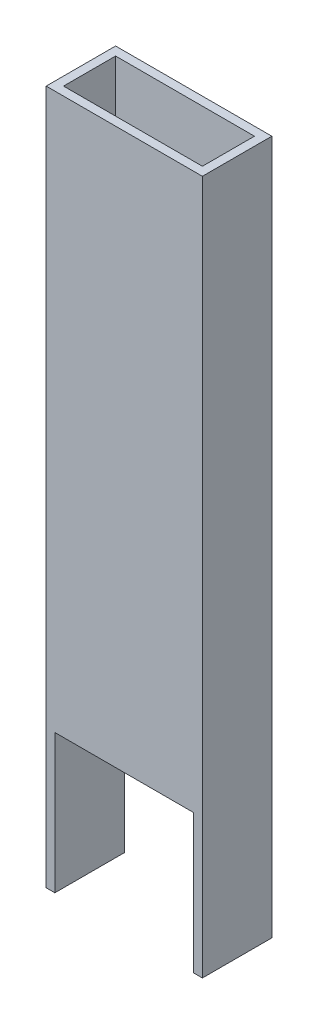
ISO-10303-21;
HEADER;
FILE_DESCRIPTION(('STEP AP214'),'2;1');
FILE_NAME('part.step','',(''),(''),'','','');
FILE_SCHEMA(('AUTOMOTIVE_DESIGN { 1 0 10303 214 1 1 1 1 }'));
ENDSEC;
DATA;
#1=APPLICATION_CONTEXT('core data for automotive mechanical design processes');
#2=APPLICATION_PROTOCOL_DEFINITION('international standard','automotive_design',2000,#1);
#3=PRODUCT_CONTEXT('',#1,'mechanical');
#4=PRODUCT('Part','Part','',(#3));
#5=PRODUCT_RELATED_PRODUCT_CATEGORY('part','',(#4));
#6=PRODUCT_DEFINITION_FORMATION('','',#4);
#7=PRODUCT_DEFINITION_CONTEXT('part definition',#1,'design');
#8=PRODUCT_DEFINITION('design','',#6,#7);
#9=PRODUCT_DEFINITION_SHAPE('','',#8);
#10=(LENGTH_UNIT() NAMED_UNIT(*) SI_UNIT(.MILLI.,.METRE.));
#11=(NAMED_UNIT(*) PLANE_ANGLE_UNIT() SI_UNIT($,.RADIAN.));
#12=(NAMED_UNIT(*) SI_UNIT($,.STERADIAN.) SOLID_ANGLE_UNIT());
#13=UNCERTAINTY_MEASURE_WITH_UNIT(LENGTH_MEASURE(1.E-05),#10,'distance_accuracy_value','');
#14=(GEOMETRIC_REPRESENTATION_CONTEXT(3) GLOBAL_UNCERTAINTY_ASSIGNED_CONTEXT((#13)) GLOBAL_UNIT_ASSIGNED_CONTEXT((#10,
#11,#12)) REPRESENTATION_CONTEXT('',''));
#15=CARTESIAN_POINT('',(0.,0.,0.));
#16=DIRECTION('',(0.,0.,1.));
#17=DIRECTION('',(1.,0.,0.));
#18=AXIS2_PLACEMENT_3D('',#15,#16,#17);
#19=CARTESIAN_POINT('',(-25.4,-76.2,12.7));
#20=DIRECTION('',(0.,1.,0.));
#21=DIRECTION('',(0.,0.,1.));
#22=AXIS2_PLACEMENT_3D('',#19,#20,#21);
#23=PLANE('',#22);
#24=DIRECTION('',(0.,0.,-1.));
#25=VECTOR('',#24,1.);
#26=CARTESIAN_POINT('',(-25.4,-76.2,12.7));
#27=LINE('',#26,#25);
#28=CARTESIAN_POINT('',(-25.4,-76.2,12.7));
#29=VERTEX_POINT('',#28);
#30=CARTESIAN_POINT('',(-25.4,-76.2,9.525));
#31=VERTEX_POINT('',#30);
#32=EDGE_CURVE('E201',#29,#31,#27,.T.);
#33=ORIENTED_EDGE('',*,*,#32,.T.);
#34=DIRECTION('',(1.,0.,0.));
#35=VECTOR('',#34,1.);
#36=CARTESIAN_POINT('',(-25.4,-76.2,9.525));
#37=LINE('',#36,#35);
#38=CARTESIAN_POINT('',(25.4,-76.2,9.525));
#39=VERTEX_POINT('',#38);
#40=EDGE_CURVE('E152',#31,#39,#37,.T.);
#41=ORIENTED_EDGE('',*,*,#40,.T.);
#42=DIRECTION('',(0.,0.,-1.));
#43=VECTOR('',#42,1.);
#44=CARTESIAN_POINT('',(25.4,-76.2,12.7));
#45=LINE('',#44,#43);
#46=CARTESIAN_POINT('',(25.4,-76.2,12.7));
#47=VERTEX_POINT('',#46);
#48=EDGE_CURVE('E198',#47,#39,#45,.T.);
#49=ORIENTED_EDGE('',*,*,#48,.F.);
#50=DIRECTION('',(1.,0.,0.));
#51=VECTOR('',#50,1.);
#52=CARTESIAN_POINT('',(-25.4,-76.2,12.7));
#53=LINE('',#52,#51);
#54=EDGE_CURVE('E168',#29,#47,#53,.T.);
#55=ORIENTED_EDGE('',*,*,#54,.F.);
#56=EDGE_LOOP('',(#33,#41,#49,#55));
#57=FACE_BOUND('',#56,.T.);
#58=ADVANCED_FACE('F33',(#57),#23,.F.);
#59=CARTESIAN_POINT('',(28.575,-127.,12.7));
#60=DIRECTION('',(-1.,0.,0.));
#61=DIRECTION('',(0.,0.,1.));
#62=AXIS2_PLACEMENT_3D('',#59,#60,#61);
#63=PLANE('',#62);
#64=DIRECTION('',(0.,1.,0.));
#65=VECTOR('',#64,1.);
#66=CARTESIAN_POINT('',(28.575,-127.,-12.7));
#67=LINE('',#66,#65);
#68=CARTESIAN_POINT('',(28.575,-127.,-12.7));
#69=VERTEX_POINT('',#68);
#70=CARTESIAN_POINT('',(28.575,127.,-12.7));
#71=VERTEX_POINT('',#70);
#72=EDGE_CURVE('E155',#69,#71,#67,.T.);
#73=ORIENTED_EDGE('',*,*,#72,.T.);
#74=DIRECTION('',(0.,0.,-1.));
#75=VECTOR('',#74,1.);
#76=CARTESIAN_POINT('',(28.575,127.,12.7));
#77=LINE('',#76,#75);
#78=CARTESIAN_POINT('',(28.575,127.,12.7));
#79=VERTEX_POINT('',#78);
#80=EDGE_CURVE('E11',#79,#71,#77,.T.);
#81=ORIENTED_EDGE('',*,*,#80,.F.);
#82=DIRECTION('',(0.,1.,0.));
#83=VECTOR('',#82,1.);
#84=CARTESIAN_POINT('',(28.575,-127.,12.7));
#85=LINE('',#84,#83);
#86=CARTESIAN_POINT('',(28.575,-127.,12.7));
#87=VERTEX_POINT('',#86);
#88=EDGE_CURVE('E156',#87,#79,#85,.T.);
#89=ORIENTED_EDGE('',*,*,#88,.F.);
#90=DIRECTION('',(0.,0.,-1.));
#91=VECTOR('',#90,1.);
#92=CARTESIAN_POINT('',(28.575,-127.,12.7));
#93=LINE('',#92,#91);
#94=EDGE_CURVE('E174',#87,#69,#93,.T.);
#95=ORIENTED_EDGE('',*,*,#94,.T.);
#96=EDGE_LOOP('',(#73,#81,#89,#95));
#97=FACE_BOUND('',#96,.T.);
#98=ADVANCED_FACE('F35',(#97),#63,.F.);
#99=CARTESIAN_POINT('',(-28.575,127.,12.7));
#100=DIRECTION('',(0.,-1.,0.));
#101=DIRECTION('',(0.,0.,-1.));
#102=AXIS2_PLACEMENT_3D('',#99,#100,#101);
#103=PLANE('',#102);
#104=DIRECTION('',(-1.,0.,0.));
#105=VECTOR('',#104,1.);
#106=CARTESIAN_POINT('',(25.4,127.,-9.525));
#107=LINE('',#106,#105);
#108=CARTESIAN_POINT('',(25.4,127.,-9.525));
#109=VERTEX_POINT('',#108);
#110=CARTESIAN_POINT('',(-25.4,127.,-9.525));
#111=VERTEX_POINT('',#110);
#112=EDGE_CURVE('E134',#109,#111,#107,.T.);
#113=ORIENTED_EDGE('',*,*,#112,.F.);
#114=DIRECTION('',(0.,0.,-1.));
#115=VECTOR('',#114,1.);
#116=CARTESIAN_POINT('',(25.4,127.,9.525));
#117=LINE('',#116,#115);
#118=CARTESIAN_POINT('',(25.4,127.,9.525));
#119=VERTEX_POINT('',#118);
#120=EDGE_CURVE('E48',#119,#109,#117,.T.);
#121=ORIENTED_EDGE('',*,*,#120,.F.);
#122=DIRECTION('',(1.,0.,0.));
#123=VECTOR('',#122,1.);
#124=CARTESIAN_POINT('',(-25.4,127.,9.525));
#125=LINE('',#124,#123);
#126=CARTESIAN_POINT('',(-25.4,127.,9.525));
#127=VERTEX_POINT('',#126);
#128=EDGE_CURVE('E141',#127,#119,#125,.T.);
#129=ORIENTED_EDGE('',*,*,#128,.F.);
#130=DIRECTION('',(0.,0.,1.));
#131=VECTOR('',#130,1.);
#132=CARTESIAN_POINT('',(-25.4,127.,-9.525));
#133=LINE('',#132,#131);
#134=EDGE_CURVE('E126',#111,#127,#133,.T.);
#135=ORIENTED_EDGE('',*,*,#134,.F.);
#136=EDGE_LOOP('',(#113,#121,#129,#135));
#137=FACE_BOUND('',#136,.T.);
#138=DIRECTION('',(-1.,0.,0.));
#139=VECTOR('',#138,1.);
#140=CARTESIAN_POINT('',(-28.575,127.,-12.7));
#141=LINE('',#140,#139);
#142=CARTESIAN_POINT('',(-28.575,127.,-12.7));
#143=VERTEX_POINT('',#142);
#144=EDGE_CURVE('E177',#71,#143,#141,.T.);
#145=ORIENTED_EDGE('',*,*,#144,.T.);
#146=DIRECTION('',(0.,0.,-1.));
#147=VECTOR('',#146,1.);
#148=CARTESIAN_POINT('',(-28.575,127.,12.7));
#149=LINE('',#148,#147);
#150=CARTESIAN_POINT('',(-28.575,127.,12.7));
#151=VERTEX_POINT('',#150);
#152=EDGE_CURVE('E41',#151,#143,#149,.T.);
#153=ORIENTED_EDGE('',*,*,#152,.F.);
#154=DIRECTION('',(-1.,0.,0.));
#155=VECTOR('',#154,1.);
#156=CARTESIAN_POINT('',(-28.575,127.,12.7));
#157=LINE('',#156,#155);
#158=EDGE_CURVE('E159',#79,#151,#157,.T.);
#159=ORIENTED_EDGE('',*,*,#158,.F.);
#160=ORIENTED_EDGE('',*,*,#80,.T.);
#161=EDGE_LOOP('',(#145,#153,#159,#160));
#162=FACE_BOUND('',#161,.T.);
#163=ADVANCED_FACE('F138',(#137,#162),#103,.F.);
#164=CARTESIAN_POINT('',(-28.575,-127.,12.7));
#165=DIRECTION('',(1.,0.,0.));
#166=DIRECTION('',(0.,0.,-1.));
#167=AXIS2_PLACEMENT_3D('',#164,#165,#166);
#168=PLANE('',#167);
#169=DIRECTION('',(0.,-1.,0.));
#170=VECTOR('',#169,1.);
#171=CARTESIAN_POINT('',(-28.575,-127.,-12.7));
#172=LINE('',#171,#170);
#173=CARTESIAN_POINT('',(-28.575,-127.,-12.7));
#174=VERTEX_POINT('',#173);
#175=EDGE_CURVE('E179',#143,#174,#172,.T.);
#176=ORIENTED_EDGE('',*,*,#175,.T.);
#177=DIRECTION('',(0.,0.,-1.));
#178=VECTOR('',#177,1.);
#179=CARTESIAN_POINT('',(-28.575,-127.,12.7));
#180=LINE('',#179,#178);
#181=CARTESIAN_POINT('',(-28.575,-127.,12.7));
#182=VERTEX_POINT('',#181);
#183=EDGE_CURVE('E206',#182,#174,#180,.T.);
#184=ORIENTED_EDGE('',*,*,#183,.F.);
#185=DIRECTION('',(0.,-1.,0.));
#186=VECTOR('',#185,1.);
#187=CARTESIAN_POINT('',(-28.575,-127.,12.7));
#188=LINE('',#187,#186);
#189=EDGE_CURVE('E162',#151,#182,#188,.T.);
#190=ORIENTED_EDGE('',*,*,#189,.F.);
#191=ORIENTED_EDGE('',*,*,#152,.T.);
#192=EDGE_LOOP('',(#176,#184,#190,#191));
#193=FACE_BOUND('',#192,.T.);
#194=ADVANCED_FACE('F213',(#193),#168,.F.);
#195=CARTESIAN_POINT('',(-28.575,-127.,12.7));
#196=DIRECTION('',(0.,1.,0.));
#197=DIRECTION('',(0.,0.,1.));
#198=AXIS2_PLACEMENT_3D('',#195,#196,#197);
#199=PLANE('',#198);
#200=DIRECTION('',(1.,0.,0.));
#201=VECTOR('',#200,1.);
#202=CARTESIAN_POINT('',(-28.575,-127.,-12.7));
#203=LINE('',#202,#201);
#204=CARTESIAN_POINT('',(-25.4,-127.,-12.7));
#205=VERTEX_POINT('',#204);
#206=EDGE_CURVE('E181',#174,#205,#203,.T.);
#207=ORIENTED_EDGE('',*,*,#206,.T.);
#208=DIRECTION('',(0.,0.,-1.));
#209=VECTOR('',#208,1.);
#210=CARTESIAN_POINT('',(-25.4,-127.,12.7));
#211=LINE('',#210,#209);
#212=CARTESIAN_POINT('',(-25.4,-127.,12.7));
#213=VERTEX_POINT('',#212);
#214=EDGE_CURVE('E204',#213,#205,#211,.T.);
#215=ORIENTED_EDGE('',*,*,#214,.F.);
#216=DIRECTION('',(1.,0.,0.));
#217=VECTOR('',#216,1.);
#218=CARTESIAN_POINT('',(-28.575,-127.,12.7));
#219=LINE('',#218,#217);
#220=EDGE_CURVE('E164',#182,#213,#219,.T.);
#221=ORIENTED_EDGE('',*,*,#220,.F.);
#222=ORIENTED_EDGE('',*,*,#183,.T.);
#223=EDGE_LOOP('',(#207,#215,#221,#222));
#224=FACE_BOUND('',#223,.T.);
#225=ADVANCED_FACE('F223',(#224),#199,.F.);
#226=CARTESIAN_POINT('',(-25.4,-127.,12.7));
#227=DIRECTION('',(-1.,0.,0.));
#228=DIRECTION('',(0.,0.,1.));
#229=AXIS2_PLACEMENT_3D('',#226,#227,#228);
#230=PLANE('',#229);
#231=CARTESIAN_POINT('',(-25.4,-76.2,-9.525));
#232=VERTEX_POINT('',#231);
#233=CARTESIAN_POINT('',(-25.4,-76.2,-12.7));
#234=VERTEX_POINT('',#233);
#235=EDGE_CURVE('E129',#232,#234,#27,.T.);
#236=ORIENTED_EDGE('',*,*,#235,.F.);
#237=DIRECTION('',(0.,1.,0.));
#238=VECTOR('',#237,1.);
#239=CARTESIAN_POINT('',(-25.4,-127.,-9.525));
#240=LINE('',#239,#238);
#241=EDGE_CURVE('E56',#232,#111,#240,.T.);
#242=ORIENTED_EDGE('',*,*,#241,.T.);
#243=ORIENTED_EDGE('',*,*,#134,.T.);
#244=DIRECTION('',(0.,1.,0.));
#245=VECTOR('',#244,1.);
#246=CARTESIAN_POINT('',(-25.4,-127.,9.525));
#247=LINE('',#246,#245);
#248=EDGE_CURVE('E130',#31,#127,#247,.T.);
#249=ORIENTED_EDGE('',*,*,#248,.F.);
#250=ORIENTED_EDGE('',*,*,#32,.F.);
#251=DIRECTION('',(0.,1.,0.));
#252=VECTOR('',#251,1.);
#253=CARTESIAN_POINT('',(-25.4,-127.,12.7));
#254=LINE('',#253,#252);
#255=EDGE_CURVE('E166',#213,#29,#254,.T.);
#256=ORIENTED_EDGE('',*,*,#255,.F.);
#257=ORIENTED_EDGE('',*,*,#214,.T.);
#258=DIRECTION('',(0.,1.,0.));
#259=VECTOR('',#258,1.);
#260=CARTESIAN_POINT('',(-25.4,-127.,-12.7));
#261=LINE('',#260,#259);
#262=EDGE_CURVE('E184',#205,#234,#261,.T.);
#263=ORIENTED_EDGE('',*,*,#262,.T.);
#264=EDGE_LOOP('',(#236,#242,#243,#249,#250,#256,#257,#263));
#265=FACE_BOUND('',#264,.T.);
#266=ADVANCED_FACE('F123',(#265),#230,.F.);
#267=CARTESIAN_POINT('',(25.4,-76.2,-9.525));
#268=VERTEX_POINT('',#267);
#269=CARTESIAN_POINT('',(25.4,-76.2,-12.7));
#270=VERTEX_POINT('',#269);
#271=EDGE_CURVE('E197',#268,#270,#45,.T.);
#272=ORIENTED_EDGE('',*,*,#271,.F.);
#273=DIRECTION('',(-1.,0.,0.));
#274=VECTOR('',#273,1.);
#275=CARTESIAN_POINT('',(-25.4,-76.2,-9.525));
#276=LINE('',#275,#274);
#277=EDGE_CURVE('E148',#268,#232,#276,.T.);
#278=ORIENTED_EDGE('',*,*,#277,.T.);
#279=ORIENTED_EDGE('',*,*,#235,.T.);
#280=DIRECTION('',(1.,0.,0.));
#281=VECTOR('',#280,1.);
#282=CARTESIAN_POINT('',(-25.4,-76.2,-12.7));
#283=LINE('',#282,#281);
#284=EDGE_CURVE('E186',#234,#270,#283,.T.);
#285=ORIENTED_EDGE('',*,*,#284,.T.);
#286=EDGE_LOOP('',(#272,#278,#279,#285));
#287=FACE_BOUND('',#286,.T.);
#288=ADVANCED_FACE('F243',(#287),#23,.F.);
#289=CARTESIAN_POINT('',(25.4,-76.2,12.7));
#290=DIRECTION('',(1.,0.,0.));
#291=DIRECTION('',(0.,1.,0.));
#292=AXIS2_PLACEMENT_3D('',#289,#290,#291);
#293=PLANE('',#292);
#294=DIRECTION('',(0.,-1.,0.));
#295=VECTOR('',#294,1.);
#296=CARTESIAN_POINT('',(25.4,-76.2,-12.7));
#297=LINE('',#296,#295);
#298=CARTESIAN_POINT('',(25.4,-127.,-12.7));
#299=VERTEX_POINT('',#298);
#300=EDGE_CURVE('E189',#270,#299,#297,.T.);
#301=ORIENTED_EDGE('',*,*,#300,.T.);
#302=DIRECTION('',(0.,0.,-1.));
#303=VECTOR('',#302,1.);
#304=CARTESIAN_POINT('',(25.4,-127.,12.7));
#305=LINE('',#304,#303);
#306=CARTESIAN_POINT('',(25.4,-127.,12.7));
#307=VERTEX_POINT('',#306);
#308=EDGE_CURVE('E195',#307,#299,#305,.T.);
#309=ORIENTED_EDGE('',*,*,#308,.F.);
#310=DIRECTION('',(0.,-1.,0.));
#311=VECTOR('',#310,1.);
#312=CARTESIAN_POINT('',(25.4,-76.2,12.7));
#313=LINE('',#312,#311);
#314=EDGE_CURVE('E170',#47,#307,#313,.T.);
#315=ORIENTED_EDGE('',*,*,#314,.F.);
#316=ORIENTED_EDGE('',*,*,#48,.T.);
#317=DIRECTION('',(0.,1.,0.));
#318=VECTOR('',#317,1.);
#319=CARTESIAN_POINT('',(25.4,-127.,9.525));
#320=LINE('',#319,#318);
#321=EDGE_CURVE('E146',#39,#119,#320,.T.);
#322=ORIENTED_EDGE('',*,*,#321,.T.);
#323=ORIENTED_EDGE('',*,*,#120,.T.);
#324=DIRECTION('',(0.,1.,0.));
#325=VECTOR('',#324,1.);
#326=CARTESIAN_POINT('',(25.4,-127.,-9.525));
#327=LINE('',#326,#325);
#328=EDGE_CURVE('E131',#268,#109,#327,.T.);
#329=ORIENTED_EDGE('',*,*,#328,.F.);
#330=ORIENTED_EDGE('',*,*,#271,.T.);
#331=EDGE_LOOP('',(#301,#309,#315,#316,#322,#323,#329,#330));
#332=FACE_BOUND('',#331,.T.);
#333=ADVANCED_FACE('F240',(#332),#293,.F.);
#334=CARTESIAN_POINT('',(25.4,-127.,12.7));
#335=DIRECTION('',(0.,1.,0.));
#336=DIRECTION('',(0.,0.,1.));
#337=AXIS2_PLACEMENT_3D('',#334,#335,#336);
#338=PLANE('',#337);
#339=DIRECTION('',(1.,0.,0.));
#340=VECTOR('',#339,1.);
#341=CARTESIAN_POINT('',(25.4,-127.,-12.7));
#342=LINE('',#341,#340);
#343=EDGE_CURVE('E160',#299,#69,#342,.T.);
#344=ORIENTED_EDGE('',*,*,#343,.T.);
#345=ORIENTED_EDGE('',*,*,#94,.F.);
#346=DIRECTION('',(1.,0.,0.));
#347=VECTOR('',#346,1.);
#348=CARTESIAN_POINT('',(25.4,-127.,12.7));
#349=LINE('',#348,#347);
#350=EDGE_CURVE('E172',#307,#87,#349,.T.);
#351=ORIENTED_EDGE('',*,*,#350,.F.);
#352=ORIENTED_EDGE('',*,*,#308,.T.);
#353=EDGE_LOOP('',(#344,#345,#351,#352));
#354=FACE_BOUND('',#353,.T.);
#355=ADVANCED_FACE('F236',(#354),#338,.F.);
#356=CARTESIAN_POINT('',(0.,0.,12.7));
#357=DIRECTION('',(0.,0.,-1.));
#358=DIRECTION('',(-1.,0.,0.));
#359=AXIS2_PLACEMENT_3D('',#356,#357,#358);
#360=PLANE('',#359);
#361=ORIENTED_EDGE('',*,*,#88,.T.);
#362=ORIENTED_EDGE('',*,*,#158,.T.);
#363=ORIENTED_EDGE('',*,*,#189,.T.);
#364=ORIENTED_EDGE('',*,*,#220,.T.);
#365=ORIENTED_EDGE('',*,*,#255,.T.);
#366=ORIENTED_EDGE('',*,*,#54,.T.);
#367=ORIENTED_EDGE('',*,*,#314,.T.);
#368=ORIENTED_EDGE('',*,*,#350,.T.);
#369=EDGE_LOOP('',(#361,#362,#363,#364,#365,#366,#367,#368));
#370=FACE_BOUND('',#369,.T.);
#371=ADVANCED_FACE('F227',(#370),#360,.F.);
#372=CARTESIAN_POINT('',(0.,0.,-12.7));
#373=DIRECTION('',(0.,0.,-1.));
#374=DIRECTION('',(-1.,0.,0.));
#375=AXIS2_PLACEMENT_3D('',#372,#373,#374);
#376=PLANE('',#375);
#377=ORIENTED_EDGE('',*,*,#72,.F.);
#378=ORIENTED_EDGE('',*,*,#343,.F.);
#379=ORIENTED_EDGE('',*,*,#300,.F.);
#380=ORIENTED_EDGE('',*,*,#284,.F.);
#381=ORIENTED_EDGE('',*,*,#262,.F.);
#382=ORIENTED_EDGE('',*,*,#206,.F.);
#383=ORIENTED_EDGE('',*,*,#175,.F.);
#384=ORIENTED_EDGE('',*,*,#144,.F.);
#385=EDGE_LOOP('',(#377,#378,#379,#380,#381,#382,#383,#384));
#386=FACE_BOUND('',#385,.T.);
#387=ADVANCED_FACE('F218',(#386),#376,.T.);
#388=CARTESIAN_POINT('',(-25.4,-127.,9.525));
#389=DIRECTION('',(0.,0.,1.));
#390=DIRECTION('',(1.,0.,0.));
#391=AXIS2_PLACEMENT_3D('',#388,#389,#390);
#392=PLANE('',#391);
#393=ORIENTED_EDGE('',*,*,#248,.T.);
#394=ORIENTED_EDGE('',*,*,#128,.T.);
#395=ORIENTED_EDGE('',*,*,#321,.F.);
#396=ORIENTED_EDGE('',*,*,#40,.F.);
#397=EDGE_LOOP('',(#393,#394,#395,#396));
#398=FACE_BOUND('',#397,.T.);
#399=ADVANCED_FACE('F248',(#398),#392,.F.);
#400=CARTESIAN_POINT('',(25.4,-127.,-9.525));
#401=DIRECTION('',(0.,0.,-1.));
#402=DIRECTION('',(-1.,0.,0.));
#403=AXIS2_PLACEMENT_3D('',#400,#401,#402);
#404=PLANE('',#403);
#405=ORIENTED_EDGE('',*,*,#328,.T.);
#406=ORIENTED_EDGE('',*,*,#112,.T.);
#407=ORIENTED_EDGE('',*,*,#241,.F.);
#408=ORIENTED_EDGE('',*,*,#277,.F.);
#409=EDGE_LOOP('',(#405,#406,#407,#408));
#410=FACE_BOUND('',#409,.T.);
#411=ADVANCED_FACE('F135',(#410),#404,.F.);
#412=CLOSED_SHELL('',(#58,#98,#163,#194,#225,#266,#288,#333,#355,#371,#387,#399,#411));
#413=MANIFOLD_SOLID_BREP('B2',#412);
#414=ADVANCED_BREP_SHAPE_REPRESENTATION('',(#18,#413),#14);
#415=SHAPE_DEFINITION_REPRESENTATION(#9,#414);
ENDSEC;
END-ISO-10303-21;
